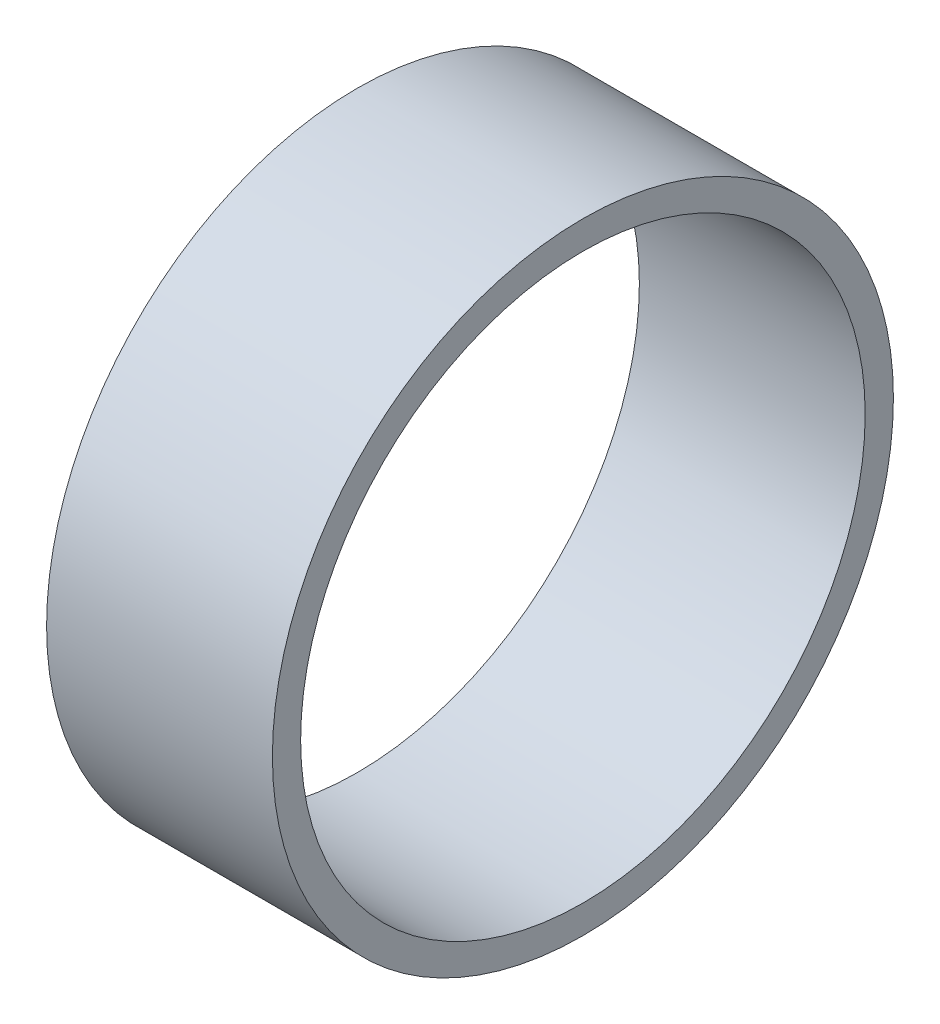
ISO-10303-21;
HEADER;
FILE_DESCRIPTION(('STEP AP214'),'2;1');
FILE_NAME('part.step','',(''),(''),'','','');
FILE_SCHEMA(('AUTOMOTIVE_DESIGN { 1 0 10303 214 1 1 1 1 }'));
ENDSEC;
DATA;
#1=APPLICATION_CONTEXT('core data for automotive mechanical design processes');
#2=APPLICATION_PROTOCOL_DEFINITION('international standard','automotive_design',2000,#1);
#3=PRODUCT_CONTEXT('',#1,'mechanical');
#4=PRODUCT('Part','Part','',(#3));
#5=PRODUCT_RELATED_PRODUCT_CATEGORY('part','',(#4));
#6=PRODUCT_DEFINITION_FORMATION('','',#4);
#7=PRODUCT_DEFINITION_CONTEXT('part definition',#1,'design');
#8=PRODUCT_DEFINITION('design','',#6,#7);
#9=PRODUCT_DEFINITION_SHAPE('','',#8);
#10=(LENGTH_UNIT() NAMED_UNIT(*) SI_UNIT(.MILLI.,.METRE.));
#11=(NAMED_UNIT(*) PLANE_ANGLE_UNIT() SI_UNIT($,.RADIAN.));
#12=(NAMED_UNIT(*) SI_UNIT($,.STERADIAN.) SOLID_ANGLE_UNIT());
#13=UNCERTAINTY_MEASURE_WITH_UNIT(LENGTH_MEASURE(1.E-05),#10,'distance_accuracy_value','');
#14=(GEOMETRIC_REPRESENTATION_CONTEXT(3) GLOBAL_UNCERTAINTY_ASSIGNED_CONTEXT((#13)) GLOBAL_UNIT_ASSIGNED_CONTEXT((#10,
#11,#12)) REPRESENTATION_CONTEXT('',''));
#15=CARTESIAN_POINT('',(0.,0.,0.));
#16=DIRECTION('',(0.,0.,1.));
#17=DIRECTION('',(1.,0.,0.));
#18=AXIS2_PLACEMENT_3D('',#15,#16,#17);
#19=CARTESIAN_POINT('',(20.,0.,0.));
#20=DIRECTION('',(1.,0.,0.));
#21=DIRECTION('',(0.,0.,-1.));
#22=AXIS2_PLACEMENT_3D('',#19,#20,#21);
#23=PLANE('',#22);
#24=CARTESIAN_POINT('',(20.,0.,0.));
#25=DIRECTION('',(1.,0.,0.));
#26=DIRECTION('',(0.,0.,-1.));
#27=AXIS2_PLACEMENT_3D('',#24,#25,#26);
#28=CIRCLE('',#27,27.5);
#29=CARTESIAN_POINT('',(20.,0.,-27.5));
#30=VERTEX_POINT('',#29);
#31=EDGE_CURVE('E12',#30,#30,#28,.T.);
#32=ORIENTED_EDGE('',*,*,#31,.T.);
#33=EDGE_LOOP('',(#32));
#34=FACE_BOUND('',#33,.T.);
#35=CARTESIAN_POINT('',(20.,0.,0.));
#36=DIRECTION('',(1.,0.,0.));
#37=DIRECTION('',(0.,0.,-1.));
#38=AXIS2_PLACEMENT_3D('',#35,#36,#37);
#39=CIRCLE('',#38,25.);
#40=CARTESIAN_POINT('',(20.,0.,-25.));
#41=VERTEX_POINT('',#40);
#42=EDGE_CURVE('E51',#41,#41,#39,.T.);
#43=ORIENTED_EDGE('',*,*,#42,.F.);
#44=EDGE_LOOP('',(#43));
#45=FACE_BOUND('',#44,.T.);
#46=ADVANCED_FACE('F40',(#34,#45),#23,.T.);
#47=CARTESIAN_POINT('',(0.,0.,0.));
#48=DIRECTION('',(1.,0.,0.));
#49=DIRECTION('',(0.,0.,-1.));
#50=AXIS2_PLACEMENT_3D('',#47,#48,#49);
#51=PLANE('',#50);
#52=CARTESIAN_POINT('',(0.,0.,0.));
#53=DIRECTION('',(1.,0.,0.));
#54=DIRECTION('',(0.,0.,-1.));
#55=AXIS2_PLACEMENT_3D('',#52,#53,#54);
#56=CIRCLE('',#55,27.5);
#57=CARTESIAN_POINT('',(0.,0.,-27.5));
#58=VERTEX_POINT('',#57);
#59=EDGE_CURVE('E44',#58,#58,#56,.T.);
#60=ORIENTED_EDGE('',*,*,#59,.F.);
#61=EDGE_LOOP('',(#60));
#62=FACE_BOUND('',#61,.T.);
#63=CARTESIAN_POINT('',(0.,0.,0.));
#64=DIRECTION('',(1.,0.,0.));
#65=DIRECTION('',(0.,0.,-1.));
#66=AXIS2_PLACEMENT_3D('',#63,#64,#65);
#67=CIRCLE('',#66,25.);
#68=CARTESIAN_POINT('',(0.,0.,-25.));
#69=VERTEX_POINT('',#68);
#70=EDGE_CURVE('E53',#69,#69,#67,.T.);
#71=ORIENTED_EDGE('',*,*,#70,.T.);
#72=EDGE_LOOP('',(#71));
#73=FACE_BOUND('',#72,.T.);
#74=ADVANCED_FACE('F63',(#62,#73),#51,.F.);
#75=CARTESIAN_POINT('',(20.,0.,0.));
#76=DIRECTION('',(-1.,0.,0.));
#77=DIRECTION('',(0.,0.,1.));
#78=AXIS2_PLACEMENT_3D('',#75,#76,#77);
#79=CYLINDRICAL_SURFACE('',#78,27.5);
#80=ORIENTED_EDGE('',*,*,#31,.F.);
#81=EDGE_LOOP('',(#80));
#82=FACE_BOUND('',#81,.T.);
#83=ORIENTED_EDGE('',*,*,#59,.T.);
#84=EDGE_LOOP('',(#83));
#85=FACE_BOUND('',#84,.T.);
#86=ADVANCED_FACE('F42',(#82,#85),#79,.T.);
#87=CARTESIAN_POINT('',(20.,0.,0.));
#88=DIRECTION('',(-1.,0.,0.));
#89=DIRECTION('',(0.,0.,1.));
#90=AXIS2_PLACEMENT_3D('',#87,#88,#89);
#91=CYLINDRICAL_SURFACE('',#90,25.);
#92=ORIENTED_EDGE('',*,*,#42,.T.);
#93=EDGE_LOOP('',(#92));
#94=FACE_BOUND('',#93,.T.);
#95=ORIENTED_EDGE('',*,*,#70,.F.);
#96=EDGE_LOOP('',(#95));
#97=FACE_BOUND('',#96,.T.);
#98=ADVANCED_FACE('F59',(#94,#97),#91,.F.);
#99=CLOSED_SHELL('',(#46,#74,#86,#98));
#100=MANIFOLD_SOLID_BREP('B2',#99);
#101=ADVANCED_BREP_SHAPE_REPRESENTATION('',(#18,#100),#14);
#102=SHAPE_DEFINITION_REPRESENTATION(#9,#101);
ENDSEC;
END-ISO-10303-21;
